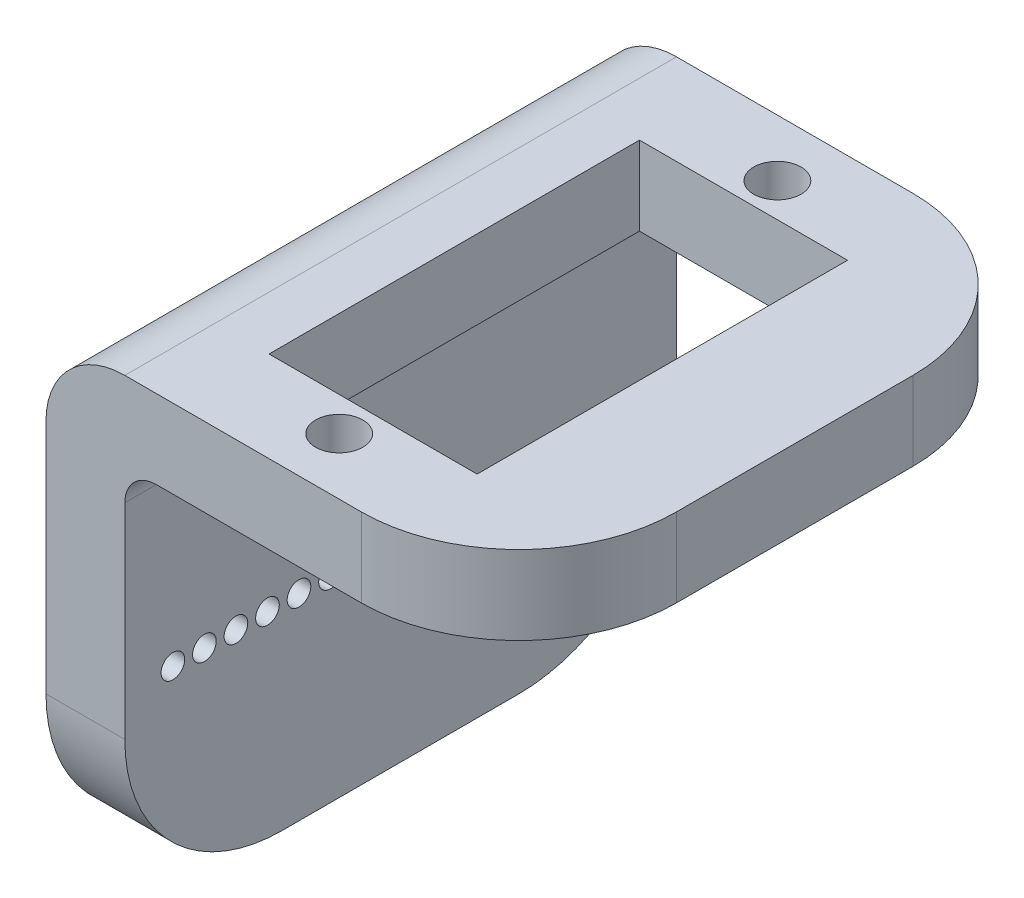
ISO-10303-21;
HEADER;
FILE_DESCRIPTION(('STEP AP214'),'2;1');
FILE_NAME('part.step','',(''),(''),'','','');
FILE_SCHEMA(('AUTOMOTIVE_DESIGN { 1 0 10303 214 1 1 1 1 }'));
ENDSEC;
DATA;
#1=APPLICATION_CONTEXT('core data for automotive mechanical design processes');
#2=APPLICATION_PROTOCOL_DEFINITION('international standard','automotive_design',2000,#1);
#3=PRODUCT_CONTEXT('',#1,'mechanical');
#4=PRODUCT('Part','Part','',(#3));
#5=PRODUCT_RELATED_PRODUCT_CATEGORY('part','',(#4));
#6=PRODUCT_DEFINITION_FORMATION('','',#4);
#7=PRODUCT_DEFINITION_CONTEXT('part definition',#1,'design');
#8=PRODUCT_DEFINITION('design','',#6,#7);
#9=PRODUCT_DEFINITION_SHAPE('','',#8);
#10=(LENGTH_UNIT() NAMED_UNIT(*) SI_UNIT(.MILLI.,.METRE.));
#11=(NAMED_UNIT(*) PLANE_ANGLE_UNIT() SI_UNIT($,.RADIAN.));
#12=(NAMED_UNIT(*) SI_UNIT($,.STERADIAN.) SOLID_ANGLE_UNIT());
#13=UNCERTAINTY_MEASURE_WITH_UNIT(LENGTH_MEASURE(1.E-05),#10,'distance_accuracy_value','');
#14=(GEOMETRIC_REPRESENTATION_CONTEXT(3) GLOBAL_UNCERTAINTY_ASSIGNED_CONTEXT((#13)) GLOBAL_UNIT_ASSIGNED_CONTEXT((#10,
#11,#12)) REPRESENTATION_CONTEXT('',''));
#15=CARTESIAN_POINT('',(0.,0.,0.));
#16=DIRECTION('',(0.,0.,1.));
#17=DIRECTION('',(1.,0.,0.));
#18=AXIS2_PLACEMENT_3D('',#15,#16,#17);
#19=CARTESIAN_POINT('',(5.,0.,17.5));
#20=DIRECTION('',(0.,0.,1.));
#21=DIRECTION('',(0.,-1.,0.));
#22=AXIS2_PLACEMENT_3D('',#19,#20,#21);
#23=PLANE('',#22);
#24=DIRECTION('',(0.,1.,0.));
#25=VECTOR('',#24,1.);
#26=CARTESIAN_POINT('',(0.,0.,17.5));
#27=LINE('',#26,#25);
#28=CARTESIAN_POINT('',(0.,-2.5,17.5));
#29=VERTEX_POINT('',#28);
#30=CARTESIAN_POINT('',(0.,12.5,17.5));
#31=VERTEX_POINT('',#30);
#32=EDGE_CURVE('E285',#29,#31,#27,.T.);
#33=ORIENTED_EDGE('',*,*,#32,.F.);
#34=DIRECTION('',(-1.,0.,0.));
#35=VECTOR('',#34,1.);
#36=CARTESIAN_POINT('',(5.,-2.5,17.5));
#37=LINE('',#36,#35);
#38=CARTESIAN_POINT('',(5.,-2.5,17.5));
#39=VERTEX_POINT('',#38);
#40=EDGE_CURVE('E11',#29,#39,#37,.F.);
#41=ORIENTED_EDGE('',*,*,#40,.T.);
#42=DIRECTION('',(0.,1.,0.));
#43=VECTOR('',#42,1.);
#44=CARTESIAN_POINT('',(5.,0.,17.5));
#45=LINE('',#44,#43);
#46=CARTESIAN_POINT('',(5.,10.5,17.5));
#47=VERTEX_POINT('',#46);
#48=EDGE_CURVE('E243',#39,#47,#45,.T.);
#49=ORIENTED_EDGE('',*,*,#48,.T.);
#50=CARTESIAN_POINT('',(7.,10.5,17.5));
#51=DIRECTION('',(0.,0.,1.));
#52=DIRECTION('',(0.,-1.,0.));
#53=AXIS2_PLACEMENT_3D('',#50,#51,#52);
#54=CIRCLE('',#53,2.);
#55=CARTESIAN_POINT('',(7.,12.5,17.5));
#56=VERTEX_POINT('',#55);
#57=EDGE_CURVE('E335',#47,#56,#54,.F.);
#58=ORIENTED_EDGE('',*,*,#57,.T.);
#59=DIRECTION('',(1.,0.,0.));
#60=VECTOR('',#59,1.);
#61=CARTESIAN_POINT('',(0.,12.5,17.5));
#62=LINE('',#61,#60);
#63=CARTESIAN_POINT('',(20.,12.5,17.5));
#64=VERTEX_POINT('',#63);
#65=EDGE_CURVE('E207',#56,#64,#62,.T.);
#66=ORIENTED_EDGE('',*,*,#65,.T.);
#67=DIRECTION('',(0.,-1.,0.));
#68=VECTOR('',#67,1.);
#69=CARTESIAN_POINT('',(20.,17.5,17.5));
#70=LINE('',#69,#68);
#71=CARTESIAN_POINT('',(20.,17.5,17.5));
#72=VERTEX_POINT('',#71);
#73=EDGE_CURVE('E316',#64,#72,#70,.F.);
#74=ORIENTED_EDGE('',*,*,#73,.T.);
#75=DIRECTION('',(1.,0.,0.));
#76=VECTOR('',#75,1.);
#77=CARTESIAN_POINT('',(0.,17.5,17.5));
#78=LINE('',#77,#76);
#79=CARTESIAN_POINT('',(5.,17.5,17.5));
#80=VERTEX_POINT('',#79);
#81=EDGE_CURVE('E197',#80,#72,#78,.T.);
#82=ORIENTED_EDGE('',*,*,#81,.F.);
#83=CARTESIAN_POINT('',(5.,12.5,17.5));
#84=DIRECTION('',(0.,0.,1.));
#85=DIRECTION('',(0.,-1.,0.));
#86=AXIS2_PLACEMENT_3D('',#83,#84,#85);
#87=CIRCLE('',#86,5.);
#88=EDGE_CURVE('E322',#80,#31,#87,.T.);
#89=ORIENTED_EDGE('',*,*,#88,.T.);
#90=EDGE_LOOP('',(#33,#41,#49,#58,#66,#74,#82,#89));
#91=FACE_BOUND('',#90,.T.);
#92=ADVANCED_FACE('F34',(#91),#23,.T.);
#93=CARTESIAN_POINT('',(5.,-12.5,0.));
#94=DIRECTION('',(0.,-1.,0.));
#95=DIRECTION('',(0.,0.,-1.));
#96=AXIS2_PLACEMENT_3D('',#93,#94,#95);
#97=PLANE('',#96);
#98=DIRECTION('',(0.,0.,1.));
#99=VECTOR('',#98,1.);
#100=CARTESIAN_POINT('',(0.,-12.5,0.));
#101=LINE('',#100,#99);
#102=CARTESIAN_POINT('',(0.,-12.5,-7.5));
#103=VERTEX_POINT('',#102);
#104=CARTESIAN_POINT('',(0.,-12.5,7.5));
#105=VERTEX_POINT('',#104);
#106=EDGE_CURVE('E287',#103,#105,#101,.T.);
#107=ORIENTED_EDGE('',*,*,#106,.F.);
#108=DIRECTION('',(-1.,0.,0.));
#109=VECTOR('',#108,1.);
#110=CARTESIAN_POINT('',(5.,-12.5,-7.5));
#111=LINE('',#110,#109);
#112=CARTESIAN_POINT('',(5.,-12.5,-7.5));
#113=VERTEX_POINT('',#112);
#114=EDGE_CURVE('E350',#103,#113,#111,.F.);
#115=ORIENTED_EDGE('',*,*,#114,.T.);
#116=DIRECTION('',(0.,0.,1.));
#117=VECTOR('',#116,1.);
#118=CARTESIAN_POINT('',(5.,-12.5,0.));
#119=LINE('',#118,#117);
#120=CARTESIAN_POINT('',(5.,-12.5,7.5));
#121=VERTEX_POINT('',#120);
#122=EDGE_CURVE('E245',#113,#121,#119,.T.);
#123=ORIENTED_EDGE('',*,*,#122,.T.);
#124=DIRECTION('',(-1.,0.,0.));
#125=VECTOR('',#124,1.);
#126=CARTESIAN_POINT('',(5.,-12.5,7.5));
#127=LINE('',#126,#125);
#128=EDGE_CURVE('E347',#121,#105,#127,.T.);
#129=ORIENTED_EDGE('',*,*,#128,.T.);
#130=EDGE_LOOP('',(#107,#115,#123,#129));
#131=FACE_BOUND('',#130,.T.);
#132=ADVANCED_FACE('F370',(#131),#97,.T.);
#133=CARTESIAN_POINT('',(5.,0.,-17.5));
#134=DIRECTION('',(0.,0.,1.));
#135=DIRECTION('',(0.,-1.,0.));
#136=AXIS2_PLACEMENT_3D('',#133,#134,#135);
#137=PLANE('',#136);
#138=DIRECTION('',(0.,1.,0.));
#139=VECTOR('',#138,1.);
#140=CARTESIAN_POINT('',(5.,0.,-17.5));
#141=LINE('',#140,#139);
#142=CARTESIAN_POINT('',(5.,-2.49999999999998,-17.5));
#143=VERTEX_POINT('',#142);
#144=CARTESIAN_POINT('',(5.,10.5,-17.5));
#145=VERTEX_POINT('',#144);
#146=EDGE_CURVE('E247',#143,#145,#141,.T.);
#147=ORIENTED_EDGE('',*,*,#146,.F.);
#148=DIRECTION('',(-1.,0.,0.));
#149=VECTOR('',#148,1.);
#150=CARTESIAN_POINT('',(0.,-2.49999999999998,-17.5));
#151=LINE('',#150,#149);
#152=CARTESIAN_POINT('',(0.,-2.49999999999998,-17.5));
#153=VERTEX_POINT('',#152);
#154=EDGE_CURVE('E340',#143,#153,#151,.T.);
#155=ORIENTED_EDGE('',*,*,#154,.T.);
#156=DIRECTION('',(0.,1.,0.));
#157=VECTOR('',#156,1.);
#158=CARTESIAN_POINT('',(0.,0.,-17.5));
#159=LINE('',#158,#157);
#160=CARTESIAN_POINT('',(0.,12.5,-17.5));
#161=VERTEX_POINT('',#160);
#162=EDGE_CURVE('E290',#153,#161,#159,.T.);
#163=ORIENTED_EDGE('',*,*,#162,.T.);
#164=CARTESIAN_POINT('',(5.,12.5,-17.5));
#165=DIRECTION('',(0.,0.,1.));
#166=DIRECTION('',(0.,-1.,0.));
#167=AXIS2_PLACEMENT_3D('',#164,#165,#166);
#168=CIRCLE('',#167,5.);
#169=CARTESIAN_POINT('',(5.,17.5,-17.5));
#170=VERTEX_POINT('',#169);
#171=EDGE_CURVE('E328',#161,#170,#168,.F.);
#172=ORIENTED_EDGE('',*,*,#171,.T.);
#173=DIRECTION('',(-1.,0.,0.));
#174=VECTOR('',#173,1.);
#175=CARTESIAN_POINT('',(0.,17.5,-17.5));
#176=LINE('',#175,#174);
#177=CARTESIAN_POINT('',(20.,17.5,-17.5));
#178=VERTEX_POINT('',#177);
#179=EDGE_CURVE('E203',#178,#170,#176,.T.);
#180=ORIENTED_EDGE('',*,*,#179,.F.);
#181=DIRECTION('',(0.,-1.,0.));
#182=VECTOR('',#181,1.);
#183=CARTESIAN_POINT('',(20.,0.,-17.5));
#184=LINE('',#183,#182);
#185=CARTESIAN_POINT('',(20.,12.5,-17.5));
#186=VERTEX_POINT('',#185);
#187=EDGE_CURVE('E258',#178,#186,#184,.T.);
#188=ORIENTED_EDGE('',*,*,#187,.T.);
#189=DIRECTION('',(-1.,0.,0.));
#190=VECTOR('',#189,1.);
#191=CARTESIAN_POINT('',(0.,12.5,-17.5));
#192=LINE('',#191,#190);
#193=CARTESIAN_POINT('',(7.,12.5,-17.5));
#194=VERTEX_POINT('',#193);
#195=EDGE_CURVE('E200',#186,#194,#192,.T.);
#196=ORIENTED_EDGE('',*,*,#195,.T.);
#197=CARTESIAN_POINT('',(7.,10.5,-17.5));
#198=DIRECTION('',(0.,0.,1.));
#199=DIRECTION('',(0.,-1.,0.));
#200=AXIS2_PLACEMENT_3D('',#197,#198,#199);
#201=CIRCLE('',#200,2.);
#202=EDGE_CURVE('E337',#194,#145,#201,.T.);
#203=ORIENTED_EDGE('',*,*,#202,.T.);
#204=EDGE_LOOP('',(#147,#155,#163,#172,#180,#188,#196,#203));
#205=FACE_BOUND('',#204,.T.);
#206=ADVANCED_FACE('F360',(#205),#137,.F.);
#207=CARTESIAN_POINT('',(5.,0.,-10.45));
#208=DIRECTION('',(-1.,0.,0.));
#209=DIRECTION('',(0.,0.,1.));
#210=AXIS2_PLACEMENT_3D('',#207,#208,#209);
#211=CYLINDRICAL_SURFACE('',#210,0.75);
#212=CARTESIAN_POINT('',(5.,0.,-10.45));
#213=DIRECTION('',(1.,0.,0.));
#214=DIRECTION('',(0.,0.,-1.));
#215=AXIS2_PLACEMENT_3D('',#212,#213,#214);
#216=CIRCLE('',#215,0.75);
#217=CARTESIAN_POINT('',(5.,0.,-11.2));
#218=VERTEX_POINT('',#217);
#219=EDGE_CURVE('E252',#218,#218,#216,.F.);
#220=ORIENTED_EDGE('',*,*,#219,.F.);
#221=EDGE_LOOP('',(#220));
#222=FACE_BOUND('',#221,.T.);
#223=CARTESIAN_POINT('',(0.,0.,-10.45));
#224=DIRECTION('',(1.,0.,0.));
#225=DIRECTION('',(0.,0.,-1.));
#226=AXIS2_PLACEMENT_3D('',#223,#224,#225);
#227=CIRCLE('',#226,0.75);
#228=CARTESIAN_POINT('',(0.,0.,-11.2));
#229=VERTEX_POINT('',#228);
#230=EDGE_CURVE('E295',#229,#229,#227,.F.);
#231=ORIENTED_EDGE('',*,*,#230,.T.);
#232=EDGE_LOOP('',(#231));
#233=FACE_BOUND('',#232,.T.);
#234=ADVANCED_FACE('F508',(#222,#233),#211,.F.);
#235=CARTESIAN_POINT('',(5.,0.,-6.45));
#236=DIRECTION('',(-1.,0.,0.));
#237=DIRECTION('',(0.,0.,1.));
#238=AXIS2_PLACEMENT_3D('',#235,#236,#237);
#239=CYLINDRICAL_SURFACE('',#238,0.75);
#240=CARTESIAN_POINT('',(5.,0.,-6.45));
#241=DIRECTION('',(1.,0.,0.));
#242=DIRECTION('',(0.,0.,-1.));
#243=AXIS2_PLACEMENT_3D('',#240,#241,#242);
#244=CIRCLE('',#243,0.75);
#245=CARTESIAN_POINT('',(5.,0.,-7.2));
#246=VERTEX_POINT('',#245);
#247=EDGE_CURVE('E249',#246,#246,#244,.F.);
#248=ORIENTED_EDGE('',*,*,#247,.F.);
#249=EDGE_LOOP('',(#248));
#250=FACE_BOUND('',#249,.T.);
#251=CARTESIAN_POINT('',(0.,0.,-6.45));
#252=DIRECTION('',(1.,0.,0.));
#253=DIRECTION('',(0.,0.,-1.));
#254=AXIS2_PLACEMENT_3D('',#251,#252,#253);
#255=CIRCLE('',#254,0.75);
#256=CARTESIAN_POINT('',(0.,0.,-7.2));
#257=VERTEX_POINT('',#256);
#258=EDGE_CURVE('E292',#257,#257,#255,.F.);
#259=ORIENTED_EDGE('',*,*,#258,.T.);
#260=EDGE_LOOP('',(#259));
#261=FACE_BOUND('',#260,.T.);
#262=ADVANCED_FACE('F427',(#250,#261),#239,.F.);
#263=CARTESIAN_POINT('',(5.,0.,14.45));
#264=DIRECTION('',(-1.,0.,0.));
#265=DIRECTION('',(0.,0.,1.));
#266=AXIS2_PLACEMENT_3D('',#263,#264,#265);
#267=CYLINDRICAL_SURFACE('',#266,0.750000000000002);
#268=CARTESIAN_POINT('',(5.,0.,14.45));
#269=DIRECTION('',(1.,0.,0.));
#270=DIRECTION('',(0.,0.,-1.));
#271=AXIS2_PLACEMENT_3D('',#268,#269,#270);
#272=CIRCLE('',#271,0.750000000000002);
#273=CARTESIAN_POINT('',(5.,0.,13.7));
#274=VERTEX_POINT('',#273);
#275=EDGE_CURVE('E240',#274,#274,#272,.T.);
#276=ORIENTED_EDGE('',*,*,#275,.T.);
#277=EDGE_LOOP('',(#276));
#278=FACE_BOUND('',#277,.T.);
#279=CARTESIAN_POINT('',(0.,0.,14.45));
#280=DIRECTION('',(1.,0.,0.));
#281=DIRECTION('',(0.,0.,-1.));
#282=AXIS2_PLACEMENT_3D('',#279,#280,#281);
#283=CIRCLE('',#282,0.750000000000002);
#284=CARTESIAN_POINT('',(0.,0.,13.7));
#285=VERTEX_POINT('',#284);
#286=EDGE_CURVE('E282',#285,#285,#283,.T.);
#287=ORIENTED_EDGE('',*,*,#286,.F.);
#288=EDGE_LOOP('',(#287));
#289=FACE_BOUND('',#288,.T.);
#290=ADVANCED_FACE('F423',(#278,#289),#267,.F.);
#291=CARTESIAN_POINT('',(5.,0.,12.45));
#292=DIRECTION('',(-1.,0.,0.));
#293=DIRECTION('',(0.,0.,1.));
#294=AXIS2_PLACEMENT_3D('',#291,#292,#293);
#295=CYLINDRICAL_SURFACE('',#294,0.75);
#296=CARTESIAN_POINT('',(5.,0.,12.45));
#297=DIRECTION('',(1.,0.,0.));
#298=DIRECTION('',(0.,0.,-1.));
#299=AXIS2_PLACEMENT_3D('',#296,#297,#298);
#300=CIRCLE('',#299,0.75);
#301=CARTESIAN_POINT('',(5.,0.,11.7));
#302=VERTEX_POINT('',#301);
#303=EDGE_CURVE('E237',#302,#302,#300,.T.);
#304=ORIENTED_EDGE('',*,*,#303,.T.);
#305=EDGE_LOOP('',(#304));
#306=FACE_BOUND('',#305,.T.);
#307=CARTESIAN_POINT('',(0.,0.,12.45));
#308=DIRECTION('',(1.,0.,0.));
#309=DIRECTION('',(0.,0.,-1.));
#310=AXIS2_PLACEMENT_3D('',#307,#308,#309);
#311=CIRCLE('',#310,0.75);
#312=CARTESIAN_POINT('',(0.,0.,11.7));
#313=VERTEX_POINT('',#312);
#314=EDGE_CURVE('E279',#313,#313,#311,.T.);
#315=ORIENTED_EDGE('',*,*,#314,.F.);
#316=EDGE_LOOP('',(#315));
#317=FACE_BOUND('',#316,.T.);
#318=ADVANCED_FACE('F426',(#306,#317),#295,.F.);
#319=CARTESIAN_POINT('',(5.,0.,10.45));
#320=DIRECTION('',(-1.,0.,0.));
#321=DIRECTION('',(0.,0.,1.));
#322=AXIS2_PLACEMENT_3D('',#319,#320,#321);
#323=CYLINDRICAL_SURFACE('',#322,0.75);
#324=CARTESIAN_POINT('',(5.,0.,10.45));
#325=DIRECTION('',(1.,0.,0.));
#326=DIRECTION('',(0.,0.,-1.));
#327=AXIS2_PLACEMENT_3D('',#324,#325,#326);
#328=CIRCLE('',#327,0.75);
#329=CARTESIAN_POINT('',(5.,0.,9.69999999999999));
#330=VERTEX_POINT('',#329);
#331=EDGE_CURVE('E234',#330,#330,#328,.T.);
#332=ORIENTED_EDGE('',*,*,#331,.T.);
#333=EDGE_LOOP('',(#332));
#334=FACE_BOUND('',#333,.T.);
#335=CARTESIAN_POINT('',(0.,0.,10.45));
#336=DIRECTION('',(1.,0.,0.));
#337=DIRECTION('',(0.,0.,-1.));
#338=AXIS2_PLACEMENT_3D('',#335,#336,#337);
#339=CIRCLE('',#338,0.75);
#340=CARTESIAN_POINT('',(0.,0.,9.69999999999999));
#341=VERTEX_POINT('',#340);
#342=EDGE_CURVE('E276',#341,#341,#339,.T.);
#343=ORIENTED_EDGE('',*,*,#342,.F.);
#344=EDGE_LOOP('',(#343));
#345=FACE_BOUND('',#344,.T.);
#346=ADVANCED_FACE('F431',(#334,#345),#323,.F.);
#347=CARTESIAN_POINT('',(5.,0.,8.44999999999999));
#348=DIRECTION('',(-1.,0.,0.));
#349=DIRECTION('',(0.,0.,1.));
#350=AXIS2_PLACEMENT_3D('',#347,#348,#349);
#351=CYLINDRICAL_SURFACE('',#350,0.75);
#352=CARTESIAN_POINT('',(5.,0.,8.44999999999999));
#353=DIRECTION('',(1.,0.,0.));
#354=DIRECTION('',(0.,0.,-1.));
#355=AXIS2_PLACEMENT_3D('',#352,#353,#354);
#356=CIRCLE('',#355,0.75);
#357=CARTESIAN_POINT('',(5.,0.,7.69999999999999));
#358=VERTEX_POINT('',#357);
#359=EDGE_CURVE('E231',#358,#358,#356,.T.);
#360=ORIENTED_EDGE('',*,*,#359,.T.);
#361=EDGE_LOOP('',(#360));
#362=FACE_BOUND('',#361,.T.);
#363=CARTESIAN_POINT('',(0.,0.,8.44999999999999));
#364=DIRECTION('',(1.,0.,0.));
#365=DIRECTION('',(0.,0.,-1.));
#366=AXIS2_PLACEMENT_3D('',#363,#364,#365);
#367=CIRCLE('',#366,0.75);
#368=CARTESIAN_POINT('',(0.,0.,7.69999999999999));
#369=VERTEX_POINT('',#368);
#370=EDGE_CURVE('E273',#369,#369,#367,.T.);
#371=ORIENTED_EDGE('',*,*,#370,.F.);
#372=EDGE_LOOP('',(#371));
#373=FACE_BOUND('',#372,.T.);
#374=ADVANCED_FACE('F435',(#362,#373),#351,.F.);
#375=CARTESIAN_POINT('',(5.,0.,6.44999999999999));
#376=DIRECTION('',(-1.,0.,0.));
#377=DIRECTION('',(0.,0.,1.));
#378=AXIS2_PLACEMENT_3D('',#375,#376,#377);
#379=CYLINDRICAL_SURFACE('',#378,0.75);
#380=CARTESIAN_POINT('',(5.,0.,6.44999999999999));
#381=DIRECTION('',(1.,0.,0.));
#382=DIRECTION('',(0.,0.,-1.));
#383=AXIS2_PLACEMENT_3D('',#380,#381,#382);
#384=CIRCLE('',#383,0.75);
#385=CARTESIAN_POINT('',(5.,0.,5.69999999999999));
#386=VERTEX_POINT('',#385);
#387=EDGE_CURVE('E228',#386,#386,#384,.T.);
#388=ORIENTED_EDGE('',*,*,#387,.T.);
#389=EDGE_LOOP('',(#388));
#390=FACE_BOUND('',#389,.T.);
#391=CARTESIAN_POINT('',(0.,0.,6.44999999999999));
#392=DIRECTION('',(1.,0.,0.));
#393=DIRECTION('',(0.,0.,-1.));
#394=AXIS2_PLACEMENT_3D('',#391,#392,#393);
#395=CIRCLE('',#394,0.75);
#396=CARTESIAN_POINT('',(0.,0.,5.69999999999999));
#397=VERTEX_POINT('',#396);
#398=EDGE_CURVE('E270',#397,#397,#395,.T.);
#399=ORIENTED_EDGE('',*,*,#398,.F.);
#400=EDGE_LOOP('',(#399));
#401=FACE_BOUND('',#400,.T.);
#402=ADVANCED_FACE('F439',(#390,#401),#379,.F.);
#403=CARTESIAN_POINT('',(5.,0.,4.44999999999999));
#404=DIRECTION('',(-1.,0.,0.));
#405=DIRECTION('',(0.,0.,1.));
#406=AXIS2_PLACEMENT_3D('',#403,#404,#405);
#407=CYLINDRICAL_SURFACE('',#406,0.750000000000002);
#408=CARTESIAN_POINT('',(5.,0.,4.44999999999999));
#409=DIRECTION('',(1.,0.,0.));
#410=DIRECTION('',(0.,0.,-1.));
#411=AXIS2_PLACEMENT_3D('',#408,#409,#410);
#412=CIRCLE('',#411,0.750000000000002);
#413=CARTESIAN_POINT('',(5.,0.,3.69999999999999));
#414=VERTEX_POINT('',#413);
#415=EDGE_CURVE('E225',#414,#414,#412,.T.);
#416=ORIENTED_EDGE('',*,*,#415,.T.);
#417=EDGE_LOOP('',(#416));
#418=FACE_BOUND('',#417,.T.);
#419=CARTESIAN_POINT('',(0.,0.,4.44999999999999));
#420=DIRECTION('',(1.,0.,0.));
#421=DIRECTION('',(0.,0.,-1.));
#422=AXIS2_PLACEMENT_3D('',#419,#420,#421);
#423=CIRCLE('',#422,0.750000000000002);
#424=CARTESIAN_POINT('',(0.,0.,3.69999999999999));
#425=VERTEX_POINT('',#424);
#426=EDGE_CURVE('E267',#425,#425,#423,.T.);
#427=ORIENTED_EDGE('',*,*,#426,.F.);
#428=EDGE_LOOP('',(#427));
#429=FACE_BOUND('',#428,.T.);
#430=ADVANCED_FACE('F443',(#418,#429),#407,.F.);
#431=CARTESIAN_POINT('',(5.,0.,-4.45));
#432=DIRECTION('',(-1.,0.,0.));
#433=DIRECTION('',(0.,0.,1.));
#434=AXIS2_PLACEMENT_3D('',#431,#432,#433);
#435=CYLINDRICAL_SURFACE('',#434,0.750000000000002);
#436=CARTESIAN_POINT('',(5.,0.,-4.45));
#437=DIRECTION('',(1.,0.,0.));
#438=DIRECTION('',(0.,0.,-1.));
#439=AXIS2_PLACEMENT_3D('',#436,#437,#438);
#440=CIRCLE('',#439,0.750000000000002);
#441=CARTESIAN_POINT('',(5.,0.,-5.2));
#442=VERTEX_POINT('',#441);
#443=EDGE_CURVE('E222',#442,#442,#440,.F.);
#444=ORIENTED_EDGE('',*,*,#443,.F.);
#445=EDGE_LOOP('',(#444));
#446=FACE_BOUND('',#445,.T.);
#447=CARTESIAN_POINT('',(0.,0.,-4.45));
#448=DIRECTION('',(1.,0.,0.));
#449=DIRECTION('',(0.,0.,-1.));
#450=AXIS2_PLACEMENT_3D('',#447,#448,#449);
#451=CIRCLE('',#450,0.750000000000002);
#452=CARTESIAN_POINT('',(0.,0.,-5.2));
#453=VERTEX_POINT('',#452);
#454=EDGE_CURVE('E264',#453,#453,#451,.F.);
#455=ORIENTED_EDGE('',*,*,#454,.T.);
#456=EDGE_LOOP('',(#455));
#457=FACE_BOUND('',#456,.T.);
#458=ADVANCED_FACE('F447',(#446,#457),#435,.F.);
#459=CARTESIAN_POINT('',(5.,0.,-8.45));
#460=DIRECTION('',(-1.,0.,0.));
#461=DIRECTION('',(0.,0.,1.));
#462=AXIS2_PLACEMENT_3D('',#459,#460,#461);
#463=CYLINDRICAL_SURFACE('',#462,0.75);
#464=CARTESIAN_POINT('',(5.,0.,-8.45));
#465=DIRECTION('',(1.,0.,0.));
#466=DIRECTION('',(0.,0.,-1.));
#467=AXIS2_PLACEMENT_3D('',#464,#465,#466);
#468=CIRCLE('',#467,0.75);
#469=CARTESIAN_POINT('',(5.,0.,-9.2));
#470=VERTEX_POINT('',#469);
#471=EDGE_CURVE('E218',#470,#470,#468,.F.);
#472=ORIENTED_EDGE('',*,*,#471,.F.);
#473=EDGE_LOOP('',(#472));
#474=FACE_BOUND('',#473,.T.);
#475=CARTESIAN_POINT('',(0.,0.,-8.45));
#476=DIRECTION('',(1.,0.,0.));
#477=DIRECTION('',(0.,0.,-1.));
#478=AXIS2_PLACEMENT_3D('',#475,#476,#477);
#479=CIRCLE('',#478,0.75);
#480=CARTESIAN_POINT('',(0.,0.,-9.2));
#481=VERTEX_POINT('',#480);
#482=EDGE_CURVE('E261',#481,#481,#479,.F.);
#483=ORIENTED_EDGE('',*,*,#482,.T.);
#484=EDGE_LOOP('',(#483));
#485=FACE_BOUND('',#484,.T.);
#486=ADVANCED_FACE('F451',(#474,#485),#463,.F.);
#487=CARTESIAN_POINT('',(5.,0.,-12.45));
#488=DIRECTION('',(-1.,0.,0.));
#489=DIRECTION('',(0.,0.,1.));
#490=AXIS2_PLACEMENT_3D('',#487,#488,#489);
#491=CYLINDRICAL_SURFACE('',#490,0.75);
#492=CARTESIAN_POINT('',(5.,0.,-12.45));
#493=DIRECTION('',(1.,0.,0.));
#494=DIRECTION('',(0.,0.,-1.));
#495=AXIS2_PLACEMENT_3D('',#492,#493,#494);
#496=CIRCLE('',#495,0.75);
#497=CARTESIAN_POINT('',(5.,0.,-13.2));
#498=VERTEX_POINT('',#497);
#499=EDGE_CURVE('E215',#498,#498,#496,.F.);
#500=ORIENTED_EDGE('',*,*,#499,.F.);
#501=EDGE_LOOP('',(#500));
#502=FACE_BOUND('',#501,.T.);
#503=CARTESIAN_POINT('',(0.,0.,-12.45));
#504=DIRECTION('',(1.,0.,0.));
#505=DIRECTION('',(0.,0.,-1.));
#506=AXIS2_PLACEMENT_3D('',#503,#504,#505);
#507=CIRCLE('',#506,0.75);
#508=CARTESIAN_POINT('',(0.,0.,-13.2));
#509=VERTEX_POINT('',#508);
#510=EDGE_CURVE('E206',#509,#509,#507,.F.);
#511=ORIENTED_EDGE('',*,*,#510,.T.);
#512=EDGE_LOOP('',(#511));
#513=FACE_BOUND('',#512,.T.);
#514=ADVANCED_FACE('F455',(#502,#513),#491,.F.);
#515=CARTESIAN_POINT('',(5.,0.,-14.45));
#516=DIRECTION('',(-1.,0.,0.));
#517=DIRECTION('',(0.,0.,1.));
#518=AXIS2_PLACEMENT_3D('',#515,#516,#517);
#519=CYLINDRICAL_SURFACE('',#518,0.750000000000002);
#520=CARTESIAN_POINT('',(5.,0.,-14.45));
#521=DIRECTION('',(1.,0.,0.));
#522=DIRECTION('',(0.,0.,-1.));
#523=AXIS2_PLACEMENT_3D('',#520,#521,#522);
#524=CIRCLE('',#523,0.750000000000002);
#525=CARTESIAN_POINT('',(5.,0.,-15.2));
#526=VERTEX_POINT('',#525);
#527=EDGE_CURVE('E255',#526,#526,#524,.F.);
#528=ORIENTED_EDGE('',*,*,#527,.F.);
#529=EDGE_LOOP('',(#528));
#530=FACE_BOUND('',#529,.T.);
#531=CARTESIAN_POINT('',(0.,0.,-14.45));
#532=DIRECTION('',(1.,0.,0.));
#533=DIRECTION('',(0.,0.,-1.));
#534=AXIS2_PLACEMENT_3D('',#531,#532,#533);
#535=CIRCLE('',#534,0.750000000000002);
#536=CARTESIAN_POINT('',(0.,0.,-15.2));
#537=VERTEX_POINT('',#536);
#538=EDGE_CURVE('E219',#537,#537,#535,.F.);
#539=ORIENTED_EDGE('',*,*,#538,.T.);
#540=EDGE_LOOP('',(#539));
#541=FACE_BOUND('',#540,.T.);
#542=ADVANCED_FACE('F459',(#530,#541),#519,.F.);
#543=CARTESIAN_POINT('',(5.,0.,0.));
#544=DIRECTION('',(1.,0.,0.));
#545=DIRECTION('',(0.,0.,-1.));
#546=AXIS2_PLACEMENT_3D('',#543,#544,#545);
#547=PLANE('',#546);
#548=ORIENTED_EDGE('',*,*,#499,.T.);
#549=EDGE_LOOP('',(#548));
#550=FACE_BOUND('',#549,.T.);
#551=ORIENTED_EDGE('',*,*,#471,.T.);
#552=EDGE_LOOP('',(#551));
#553=FACE_BOUND('',#552,.T.);
#554=ORIENTED_EDGE('',*,*,#443,.T.);
#555=EDGE_LOOP('',(#554));
#556=FACE_BOUND('',#555,.T.);
#557=ORIENTED_EDGE('',*,*,#415,.F.);
#558=EDGE_LOOP('',(#557));
#559=FACE_BOUND('',#558,.T.);
#560=ORIENTED_EDGE('',*,*,#387,.F.);
#561=EDGE_LOOP('',(#560));
#562=FACE_BOUND('',#561,.T.);
#563=ORIENTED_EDGE('',*,*,#359,.F.);
#564=EDGE_LOOP('',(#563));
#565=FACE_BOUND('',#564,.T.);
#566=ORIENTED_EDGE('',*,*,#331,.F.);
#567=EDGE_LOOP('',(#566));
#568=FACE_BOUND('',#567,.T.);
#569=ORIENTED_EDGE('',*,*,#303,.F.);
#570=EDGE_LOOP('',(#569));
#571=FACE_BOUND('',#570,.T.);
#572=ORIENTED_EDGE('',*,*,#275,.F.);
#573=EDGE_LOOP('',(#572));
#574=FACE_BOUND('',#573,.T.);
#575=ORIENTED_EDGE('',*,*,#122,.F.);
#576=CARTESIAN_POINT('',(5.,-2.49999999999999,-7.5));
#577=DIRECTION('',(1.,0.,0.));
#578=DIRECTION('',(0.,0.,-1.));
#579=AXIS2_PLACEMENT_3D('',#576,#577,#578);
#580=CIRCLE('',#579,10.);
#581=EDGE_CURVE('E42',#113,#143,#580,.T.);
#582=ORIENTED_EDGE('',*,*,#581,.T.);
#583=ORIENTED_EDGE('',*,*,#146,.T.);
#584=DIRECTION('',(0.,0.,1.));
#585=VECTOR('',#584,1.);
#586=CARTESIAN_POINT('',(5.,10.5,0.));
#587=LINE('',#586,#585);
#588=EDGE_CURVE('E330',#145,#47,#587,.T.);
#589=ORIENTED_EDGE('',*,*,#588,.T.);
#590=ORIENTED_EDGE('',*,*,#48,.F.);
#591=CARTESIAN_POINT('',(5.,-2.49999999999999,7.5));
#592=DIRECTION('',(1.,0.,0.));
#593=DIRECTION('',(0.,0.,-1.));
#594=AXIS2_PLACEMENT_3D('',#591,#592,#593);
#595=CIRCLE('',#594,10.);
#596=EDGE_CURVE('E54',#39,#121,#595,.T.);
#597=ORIENTED_EDGE('',*,*,#596,.T.);
#598=EDGE_LOOP('',(#575,#582,#583,#589,#590,#597));
#599=FACE_BOUND('',#598,.T.);
#600=ORIENTED_EDGE('',*,*,#247,.T.);
#601=EDGE_LOOP('',(#600));
#602=FACE_BOUND('',#601,.T.);
#603=ORIENTED_EDGE('',*,*,#219,.T.);
#604=EDGE_LOOP('',(#603));
#605=FACE_BOUND('',#604,.T.);
#606=ORIENTED_EDGE('',*,*,#527,.T.);
#607=EDGE_LOOP('',(#606));
#608=FACE_BOUND('',#607,.T.);
#609=ADVANCED_FACE('F354',(#550,#553,#556,#559,#562,#565,#568,#571,#574,#599,#602,#605,#608),
#547,.T.);
#610=CARTESIAN_POINT('',(0.,0.,0.));
#611=DIRECTION('',(1.,0.,0.));
#612=DIRECTION('',(0.,0.,-1.));
#613=AXIS2_PLACEMENT_3D('',#610,#611,#612);
#614=PLANE('',#613);
#615=ORIENTED_EDGE('',*,*,#510,.F.);
#616=EDGE_LOOP('',(#615));
#617=FACE_BOUND('',#616,.T.);
#618=ORIENTED_EDGE('',*,*,#482,.F.);
#619=EDGE_LOOP('',(#618));
#620=FACE_BOUND('',#619,.T.);
#621=ORIENTED_EDGE('',*,*,#454,.F.);
#622=EDGE_LOOP('',(#621));
#623=FACE_BOUND('',#622,.T.);
#624=ORIENTED_EDGE('',*,*,#426,.T.);
#625=EDGE_LOOP('',(#624));
#626=FACE_BOUND('',#625,.T.);
#627=ORIENTED_EDGE('',*,*,#398,.T.);
#628=EDGE_LOOP('',(#627));
#629=FACE_BOUND('',#628,.T.);
#630=ORIENTED_EDGE('',*,*,#370,.T.);
#631=EDGE_LOOP('',(#630));
#632=FACE_BOUND('',#631,.T.);
#633=ORIENTED_EDGE('',*,*,#342,.T.);
#634=EDGE_LOOP('',(#633));
#635=FACE_BOUND('',#634,.T.);
#636=ORIENTED_EDGE('',*,*,#314,.T.);
#637=EDGE_LOOP('',(#636));
#638=FACE_BOUND('',#637,.T.);
#639=ORIENTED_EDGE('',*,*,#286,.T.);
#640=EDGE_LOOP('',(#639));
#641=FACE_BOUND('',#640,.T.);
#642=ORIENTED_EDGE('',*,*,#162,.F.);
#643=CARTESIAN_POINT('',(0.,-2.49999999999999,-7.5));
#644=DIRECTION('',(1.,0.,0.));
#645=DIRECTION('',(0.,0.,-1.));
#646=AXIS2_PLACEMENT_3D('',#643,#644,#645);
#647=CIRCLE('',#646,10.);
#648=EDGE_CURVE('E345',#153,#103,#647,.F.);
#649=ORIENTED_EDGE('',*,*,#648,.T.);
#650=ORIENTED_EDGE('',*,*,#106,.T.);
#651=CARTESIAN_POINT('',(0.,-2.49999999999999,7.5));
#652=DIRECTION('',(1.,0.,0.));
#653=DIRECTION('',(0.,0.,-1.));
#654=AXIS2_PLACEMENT_3D('',#651,#652,#653);
#655=CIRCLE('',#654,10.);
#656=EDGE_CURVE('E343',#105,#29,#655,.F.);
#657=ORIENTED_EDGE('',*,*,#656,.T.);
#658=ORIENTED_EDGE('',*,*,#32,.T.);
#659=DIRECTION('',(0.,0.,1.));
#660=VECTOR('',#659,1.);
#661=CARTESIAN_POINT('',(0.,12.5,-17.5));
#662=LINE('',#661,#660);
#663=EDGE_CURVE('E325',#31,#161,#662,.F.);
#664=ORIENTED_EDGE('',*,*,#663,.T.);
#665=EDGE_LOOP('',(#642,#649,#650,#657,#658,#664));
#666=FACE_BOUND('',#665,.T.);
#667=ORIENTED_EDGE('',*,*,#258,.F.);
#668=EDGE_LOOP('',(#667));
#669=FACE_BOUND('',#668,.T.);
#670=ORIENTED_EDGE('',*,*,#230,.F.);
#671=EDGE_LOOP('',(#670));
#672=FACE_BOUND('',#671,.T.);
#673=ORIENTED_EDGE('',*,*,#538,.F.);
#674=EDGE_LOOP('',(#673));
#675=FACE_BOUND('',#674,.T.);
#676=ADVANCED_FACE('F367',(#617,#620,#623,#626,#629,#632,#635,#638,#641,#666,#669,#672,#675),
#614,.F.);
#677=CARTESIAN_POINT('',(30.,17.5,-17.5));
#678=DIRECTION('',(-1.,0.,0.));
#679=DIRECTION('',(0.,0.,1.));
#680=AXIS2_PLACEMENT_3D('',#677,#678,#679);
#681=PLANE('',#680);
#682=DIRECTION('',(0.,0.,-1.));
#683=VECTOR('',#682,1.);
#684=CARTESIAN_POINT('',(30.,12.5,-17.5));
#685=LINE('',#684,#683);
#686=CARTESIAN_POINT('',(30.,12.5,7.50000000000001));
#687=VERTEX_POINT('',#686);
#688=CARTESIAN_POINT('',(30.,12.5,-7.5));
#689=VERTEX_POINT('',#688);
#690=EDGE_CURVE('E209',#687,#689,#685,.T.);
#691=ORIENTED_EDGE('',*,*,#690,.T.);
#692=DIRECTION('',(0.,-1.,0.));
#693=VECTOR('',#692,1.);
#694=CARTESIAN_POINT('',(30.,17.5,-7.49999999999999));
#695=LINE('',#694,#693);
#696=CARTESIAN_POINT('',(30.,17.5,-7.49999999999999));
#697=VERTEX_POINT('',#696);
#698=EDGE_CURVE('E310',#689,#697,#695,.F.);
#699=ORIENTED_EDGE('',*,*,#698,.T.);
#700=DIRECTION('',(0.,0.,-1.));
#701=VECTOR('',#700,1.);
#702=CARTESIAN_POINT('',(30.,17.5,-17.5));
#703=LINE('',#702,#701);
#704=CARTESIAN_POINT('',(30.,17.5,7.50000000000001));
#705=VERTEX_POINT('',#704);
#706=EDGE_CURVE('E199',#705,#697,#703,.T.);
#707=ORIENTED_EDGE('',*,*,#706,.F.);
#708=DIRECTION('',(0.,-1.,0.));
#709=VECTOR('',#708,1.);
#710=CARTESIAN_POINT('',(30.,12.5,7.50000000000001));
#711=LINE('',#710,#709);
#712=EDGE_CURVE('E307',#705,#687,#711,.T.);
#713=ORIENTED_EDGE('',*,*,#712,.T.);
#714=EDGE_LOOP('',(#691,#699,#707,#713));
#715=FACE_BOUND('',#714,.T.);
#716=ADVANCED_FACE('F402',(#715),#681,.F.);
#717=CARTESIAN_POINT('',(0.,17.5,0.));
#718=DIRECTION('',(0.,1.,0.));
#719=DIRECTION('',(0.,0.,1.));
#720=AXIS2_PLACEMENT_3D('',#717,#718,#719);
#721=PLANE('',#720);
#722=CARTESIAN_POINT('',(15.,17.5,-13.9));
#723=DIRECTION('',(0.,1.,0.));
#724=DIRECTION('',(0.,0.,1.));
#725=AXIS2_PLACEMENT_3D('',#722,#723,#724);
#726=CIRCLE('',#725,1.5);
#727=CARTESIAN_POINT('',(15.,17.5,-12.4));
#728=VERTEX_POINT('',#727);
#729=EDGE_CURVE('E167',#728,#728,#726,.T.);
#730=ORIENTED_EDGE('',*,*,#729,.F.);
#731=EDGE_LOOP('',(#730));
#732=FACE_BOUND('',#731,.T.);
#733=DIRECTION('',(1.,0.,0.));
#734=VECTOR('',#733,1.);
#735=CARTESIAN_POINT('',(21.6,17.5,11.75));
#736=LINE('',#735,#734);
#737=CARTESIAN_POINT('',(8.4,17.5,11.75));
#738=VERTEX_POINT('',#737);
#739=CARTESIAN_POINT('',(21.6,17.5,11.75));
#740=VERTEX_POINT('',#739);
#741=EDGE_CURVE('E154',#738,#740,#736,.T.);
#742=ORIENTED_EDGE('',*,*,#741,.F.);
#743=DIRECTION('',(0.,0.,1.));
#744=VECTOR('',#743,1.);
#745=CARTESIAN_POINT('',(8.4,17.5,-11.75));
#746=LINE('',#745,#744);
#747=CARTESIAN_POINT('',(8.4,17.5,-11.75));
#748=VERTEX_POINT('',#747);
#749=EDGE_CURVE('E159',#748,#738,#746,.T.);
#750=ORIENTED_EDGE('',*,*,#749,.F.);
#751=DIRECTION('',(-1.,0.,0.));
#752=VECTOR('',#751,1.);
#753=CARTESIAN_POINT('',(21.6,17.5,-11.75));
#754=LINE('',#753,#752);
#755=CARTESIAN_POINT('',(21.6,17.5,-11.75));
#756=VERTEX_POINT('',#755);
#757=EDGE_CURVE('E182',#756,#748,#754,.T.);
#758=ORIENTED_EDGE('',*,*,#757,.F.);
#759=DIRECTION('',(0.,0.,-1.));
#760=VECTOR('',#759,1.);
#761=CARTESIAN_POINT('',(21.6,17.5,-11.75));
#762=LINE('',#761,#760);
#763=EDGE_CURVE('E175',#740,#756,#762,.T.);
#764=ORIENTED_EDGE('',*,*,#763,.F.);
#765=EDGE_LOOP('',(#742,#750,#758,#764));
#766=FACE_BOUND('',#765,.T.);
#767=CARTESIAN_POINT('',(15.,17.5,13.9));
#768=DIRECTION('',(0.,1.,0.));
#769=DIRECTION('',(0.,0.,1.));
#770=AXIS2_PLACEMENT_3D('',#767,#768,#769);
#771=CIRCLE('',#770,1.5);
#772=CARTESIAN_POINT('',(15.,17.5,15.4));
#773=VERTEX_POINT('',#772);
#774=EDGE_CURVE('E191',#773,#773,#771,.T.);
#775=ORIENTED_EDGE('',*,*,#774,.F.);
#776=EDGE_LOOP('',(#775));
#777=FACE_BOUND('',#776,.T.);
#778=ORIENTED_EDGE('',*,*,#179,.T.);
#779=DIRECTION('',(0.,0.,1.));
#780=VECTOR('',#779,1.);
#781=CARTESIAN_POINT('',(5.,17.5,17.5));
#782=LINE('',#781,#780);
#783=EDGE_CURVE('E319',#170,#80,#782,.T.);
#784=ORIENTED_EDGE('',*,*,#783,.T.);
#785=ORIENTED_EDGE('',*,*,#81,.T.);
#786=CARTESIAN_POINT('',(20.,17.5,7.50000000000001));
#787=DIRECTION('',(0.,1.,0.));
#788=DIRECTION('',(0.,0.,1.));
#789=AXIS2_PLACEMENT_3D('',#786,#787,#788);
#790=CIRCLE('',#789,10.);
#791=EDGE_CURVE('E312',#72,#705,#790,.T.);
#792=ORIENTED_EDGE('',*,*,#791,.T.);
#793=ORIENTED_EDGE('',*,*,#706,.T.);
#794=CARTESIAN_POINT('',(20.,17.5,-7.49999999999999));
#795=DIRECTION('',(0.,1.,0.));
#796=DIRECTION('',(0.,0.,1.));
#797=AXIS2_PLACEMENT_3D('',#794,#795,#796);
#798=CIRCLE('',#797,10.);
#799=EDGE_CURVE('E314',#697,#178,#798,.T.);
#800=ORIENTED_EDGE('',*,*,#799,.T.);
#801=EDGE_LOOP('',(#778,#784,#785,#792,#793,#800));
#802=FACE_BOUND('',#801,.T.);
#803=ADVANCED_FACE('F382',(#732,#766,#777,#802),#721,.T.);
#804=CARTESIAN_POINT('',(0.,12.5,0.));
#805=DIRECTION('',(0.,1.,0.));
#806=DIRECTION('',(0.,0.,1.));
#807=AXIS2_PLACEMENT_3D('',#804,#805,#806);
#808=PLANE('',#807);
#809=CARTESIAN_POINT('',(15.,12.5,-13.9));
#810=DIRECTION('',(0.,1.,0.));
#811=DIRECTION('',(0.,0.,1.));
#812=AXIS2_PLACEMENT_3D('',#809,#810,#811);
#813=CIRCLE('',#812,1.5);
#814=CARTESIAN_POINT('',(15.,12.5,-12.4));
#815=VERTEX_POINT('',#814);
#816=EDGE_CURVE('E210',#815,#815,#813,.F.);
#817=ORIENTED_EDGE('',*,*,#816,.F.);
#818=EDGE_LOOP('',(#817));
#819=FACE_BOUND('',#818,.T.);
#820=DIRECTION('',(0.,0.,-1.));
#821=VECTOR('',#820,1.);
#822=CARTESIAN_POINT('',(8.4,12.5,-11.75));
#823=LINE('',#822,#821);
#824=CARTESIAN_POINT('',(8.4,12.5,11.75));
#825=VERTEX_POINT('',#824);
#826=CARTESIAN_POINT('',(8.4,12.5,-11.75));
#827=VERTEX_POINT('',#826);
#828=EDGE_CURVE('E173',#825,#827,#823,.T.);
#829=ORIENTED_EDGE('',*,*,#828,.F.);
#830=DIRECTION('',(-1.,0.,0.));
#831=VECTOR('',#830,1.);
#832=CARTESIAN_POINT('',(21.6,12.5,11.75));
#833=LINE('',#832,#831);
#834=CARTESIAN_POINT('',(21.6,12.5,11.75));
#835=VERTEX_POINT('',#834);
#836=EDGE_CURVE('E151',#835,#825,#833,.T.);
#837=ORIENTED_EDGE('',*,*,#836,.F.);
#838=DIRECTION('',(0.,0.,1.));
#839=VECTOR('',#838,1.);
#840=CARTESIAN_POINT('',(21.6,12.5,-11.75));
#841=LINE('',#840,#839);
#842=CARTESIAN_POINT('',(21.6,12.5,-11.75));
#843=VERTEX_POINT('',#842);
#844=EDGE_CURVE('E163',#843,#835,#841,.T.);
#845=ORIENTED_EDGE('',*,*,#844,.F.);
#846=DIRECTION('',(1.,0.,0.));
#847=VECTOR('',#846,1.);
#848=CARTESIAN_POINT('',(21.6,12.5,-11.75));
#849=LINE('',#848,#847);
#850=EDGE_CURVE('E177',#827,#843,#849,.T.);
#851=ORIENTED_EDGE('',*,*,#850,.F.);
#852=EDGE_LOOP('',(#829,#837,#845,#851));
#853=FACE_BOUND('',#852,.T.);
#854=CARTESIAN_POINT('',(15.,12.5,13.9));
#855=DIRECTION('',(0.,1.,0.));
#856=DIRECTION('',(0.,0.,1.));
#857=AXIS2_PLACEMENT_3D('',#854,#855,#856);
#858=CIRCLE('',#857,1.5);
#859=CARTESIAN_POINT('',(15.,12.5,15.4));
#860=VERTEX_POINT('',#859);
#861=EDGE_CURVE('E194',#860,#860,#858,.F.);
#862=ORIENTED_EDGE('',*,*,#861,.F.);
#863=EDGE_LOOP('',(#862));
#864=FACE_BOUND('',#863,.T.);
#865=ORIENTED_EDGE('',*,*,#65,.F.);
#866=DIRECTION('',(0.,0.,1.));
#867=VECTOR('',#866,1.);
#868=CARTESIAN_POINT('',(7.,12.5,0.));
#869=LINE('',#868,#867);
#870=EDGE_CURVE('E333',#56,#194,#869,.F.);
#871=ORIENTED_EDGE('',*,*,#870,.T.);
#872=ORIENTED_EDGE('',*,*,#195,.F.);
#873=CARTESIAN_POINT('',(20.,12.5,-7.49999999999999));
#874=DIRECTION('',(0.,1.,0.));
#875=DIRECTION('',(0.,0.,1.));
#876=AXIS2_PLACEMENT_3D('',#873,#874,#875);
#877=CIRCLE('',#876,10.);
#878=EDGE_CURVE('E305',#186,#689,#877,.F.);
#879=ORIENTED_EDGE('',*,*,#878,.T.);
#880=ORIENTED_EDGE('',*,*,#690,.F.);
#881=CARTESIAN_POINT('',(20.,12.5,7.50000000000001));
#882=DIRECTION('',(0.,1.,0.));
#883=DIRECTION('',(0.,0.,1.));
#884=AXIS2_PLACEMENT_3D('',#881,#882,#883);
#885=CIRCLE('',#884,10.);
#886=EDGE_CURVE('E302',#687,#64,#885,.F.);
#887=ORIENTED_EDGE('',*,*,#886,.T.);
#888=EDGE_LOOP('',(#865,#871,#872,#879,#880,#887));
#889=FACE_BOUND('',#888,.T.);
#890=ADVANCED_FACE('F170',(#819,#853,#864,#889),#808,.F.);
#891=CARTESIAN_POINT('',(15.,-12.501,13.9));
#892=DIRECTION('',(0.,1.,0.));
#893=DIRECTION('',(0.,0.,1.));
#894=AXIS2_PLACEMENT_3D('',#891,#892,#893);
#895=CYLINDRICAL_SURFACE('',#894,1.5);
#896=ORIENTED_EDGE('',*,*,#774,.T.);
#897=EDGE_LOOP('',(#896));
#898=FACE_BOUND('',#897,.T.);
#899=ORIENTED_EDGE('',*,*,#861,.T.);
#900=EDGE_LOOP('',(#899));
#901=FACE_BOUND('',#900,.T.);
#902=ADVANCED_FACE('F535',(#898,#901),#895,.F.);
#903=CARTESIAN_POINT('',(21.6,-12.501,11.75));
#904=DIRECTION('',(0.,0.,1.));
#905=DIRECTION('',(1.,0.,0.));
#906=AXIS2_PLACEMENT_3D('',#903,#904,#905);
#907=PLANE('',#906);
#908=ORIENTED_EDGE('',*,*,#836,.T.);
#909=DIRECTION('',(0.,1.,0.));
#910=VECTOR('',#909,1.);
#911=CARTESIAN_POINT('',(8.4,-12.501,11.75));
#912=LINE('',#911,#910);
#913=EDGE_CURVE('E168',#825,#738,#912,.T.);
#914=ORIENTED_EDGE('',*,*,#913,.T.);
#915=ORIENTED_EDGE('',*,*,#741,.T.);
#916=DIRECTION('',(0.,1.,0.));
#917=VECTOR('',#916,1.);
#918=CARTESIAN_POINT('',(21.6,-12.501,11.75));
#919=LINE('',#918,#917);
#920=EDGE_CURVE('E147',#835,#740,#919,.T.);
#921=ORIENTED_EDGE('',*,*,#920,.F.);
#922=EDGE_LOOP('',(#908,#914,#915,#921));
#923=FACE_BOUND('',#922,.T.);
#924=ADVANCED_FACE('F149',(#923),#907,.F.);
#925=CARTESIAN_POINT('',(8.4,-12.501,-11.75));
#926=DIRECTION('',(-1.,0.,0.));
#927=DIRECTION('',(0.,0.,1.));
#928=AXIS2_PLACEMENT_3D('',#925,#926,#927);
#929=PLANE('',#928);
#930=ORIENTED_EDGE('',*,*,#828,.T.);
#931=DIRECTION('',(0.,1.,0.));
#932=VECTOR('',#931,1.);
#933=CARTESIAN_POINT('',(8.4,-12.501,-11.75));
#934=LINE('',#933,#932);
#935=EDGE_CURVE('E188',#827,#748,#934,.T.);
#936=ORIENTED_EDGE('',*,*,#935,.T.);
#937=ORIENTED_EDGE('',*,*,#749,.T.);
#938=ORIENTED_EDGE('',*,*,#913,.F.);
#939=EDGE_LOOP('',(#930,#936,#937,#938));
#940=FACE_BOUND('',#939,.T.);
#941=ADVANCED_FACE('F590',(#940),#929,.F.);
#942=CARTESIAN_POINT('',(21.6,-12.501,-11.75));
#943=DIRECTION('',(0.,0.,-1.));
#944=DIRECTION('',(-1.,0.,0.));
#945=AXIS2_PLACEMENT_3D('',#942,#943,#944);
#946=PLANE('',#945);
#947=ORIENTED_EDGE('',*,*,#850,.T.);
#948=DIRECTION('',(0.,1.,0.));
#949=VECTOR('',#948,1.);
#950=CARTESIAN_POINT('',(21.6,-12.501,-11.75));
#951=LINE('',#950,#949);
#952=EDGE_CURVE('E158',#843,#756,#951,.T.);
#953=ORIENTED_EDGE('',*,*,#952,.T.);
#954=ORIENTED_EDGE('',*,*,#757,.T.);
#955=ORIENTED_EDGE('',*,*,#935,.F.);
#956=EDGE_LOOP('',(#947,#953,#954,#955));
#957=FACE_BOUND('',#956,.T.);
#958=ADVANCED_FACE('F581',(#957),#946,.F.);
#959=CARTESIAN_POINT('',(21.6,-12.501,-11.75));
#960=DIRECTION('',(1.,0.,0.));
#961=DIRECTION('',(0.,0.,-1.));
#962=AXIS2_PLACEMENT_3D('',#959,#960,#961);
#963=PLANE('',#962);
#964=ORIENTED_EDGE('',*,*,#844,.T.);
#965=ORIENTED_EDGE('',*,*,#920,.T.);
#966=ORIENTED_EDGE('',*,*,#763,.T.);
#967=ORIENTED_EDGE('',*,*,#952,.F.);
#968=EDGE_LOOP('',(#964,#965,#966,#967));
#969=FACE_BOUND('',#968,.T.);
#970=ADVANCED_FACE('F164',(#969),#963,.F.);
#971=CARTESIAN_POINT('',(15.,-12.501,-13.9));
#972=DIRECTION('',(0.,1.,0.));
#973=DIRECTION('',(0.,0.,1.));
#974=AXIS2_PLACEMENT_3D('',#971,#972,#973);
#975=CYLINDRICAL_SURFACE('',#974,1.5);
#976=ORIENTED_EDGE('',*,*,#729,.T.);
#977=EDGE_LOOP('',(#976));
#978=FACE_BOUND('',#977,.T.);
#979=ORIENTED_EDGE('',*,*,#816,.T.);
#980=EDGE_LOOP('',(#979));
#981=FACE_BOUND('',#980,.T.);
#982=ADVANCED_FACE('F463',(#978,#981),#975,.F.);
#983=CARTESIAN_POINT('',(20.,0.,-7.5));
#984=DIRECTION('',(0.,-1.,0.));
#985=DIRECTION('',(0.,0.,-1.));
#986=AXIS2_PLACEMENT_3D('',#983,#984,#985);
#987=CYLINDRICAL_SURFACE('',#986,10.);
#988=ORIENTED_EDGE('',*,*,#799,.F.);
#989=ORIENTED_EDGE('',*,*,#698,.F.);
#990=ORIENTED_EDGE('',*,*,#878,.F.);
#991=ORIENTED_EDGE('',*,*,#187,.F.);
#992=EDGE_LOOP('',(#988,#989,#990,#991));
#993=FACE_BOUND('',#992,.T.);
#994=ADVANCED_FACE('F387',(#993),#987,.T.);
#995=CARTESIAN_POINT('',(20.,17.5,7.50000000000001));
#996=DIRECTION('',(0.,1.,0.));
#997=DIRECTION('',(0.,0.,1.));
#998=AXIS2_PLACEMENT_3D('',#995,#996,#997);
#999=CYLINDRICAL_SURFACE('',#998,10.);
#1000=ORIENTED_EDGE('',*,*,#791,.F.);
#1001=ORIENTED_EDGE('',*,*,#73,.F.);
#1002=ORIENTED_EDGE('',*,*,#886,.F.);
#1003=ORIENTED_EDGE('',*,*,#712,.F.);
#1004=EDGE_LOOP('',(#1000,#1001,#1002,#1003));
#1005=FACE_BOUND('',#1004,.T.);
#1006=ADVANCED_FACE('F400',(#1005),#999,.T.);
#1007=CARTESIAN_POINT('',(5.,12.5,0.));
#1008=DIRECTION('',(0.,0.,-1.));
#1009=DIRECTION('',(-1.,0.,0.));
#1010=AXIS2_PLACEMENT_3D('',#1007,#1008,#1009);
#1011=CYLINDRICAL_SURFACE('',#1010,5.);
#1012=ORIENTED_EDGE('',*,*,#171,.F.);
#1013=ORIENTED_EDGE('',*,*,#663,.F.);
#1014=ORIENTED_EDGE('',*,*,#88,.F.);
#1015=ORIENTED_EDGE('',*,*,#783,.F.);
#1016=EDGE_LOOP('',(#1012,#1013,#1014,#1015));
#1017=FACE_BOUND('',#1016,.T.);
#1018=ADVANCED_FACE('F378',(#1017),#1011,.T.);
#1019=CARTESIAN_POINT('',(7.,10.5,0.));
#1020=DIRECTION('',(0.,0.,1.));
#1021=DIRECTION('',(1.,0.,0.));
#1022=AXIS2_PLACEMENT_3D('',#1019,#1020,#1021);
#1023=CYLINDRICAL_SURFACE('',#1022,2.);
#1024=ORIENTED_EDGE('',*,*,#202,.F.);
#1025=ORIENTED_EDGE('',*,*,#870,.F.);
#1026=ORIENTED_EDGE('',*,*,#57,.F.);
#1027=ORIENTED_EDGE('',*,*,#588,.F.);
#1028=EDGE_LOOP('',(#1024,#1025,#1026,#1027));
#1029=FACE_BOUND('',#1028,.T.);
#1030=ADVANCED_FACE('F395',(#1029),#1023,.F.);
#1031=CARTESIAN_POINT('',(5.,-2.49999999999999,-7.5));
#1032=DIRECTION('',(1.,0.,0.));
#1033=DIRECTION('',(0.,0.,-1.));
#1034=AXIS2_PLACEMENT_3D('',#1031,#1032,#1033);
#1035=CYLINDRICAL_SURFACE('',#1034,10.);
#1036=ORIENTED_EDGE('',*,*,#581,.F.);
#1037=ORIENTED_EDGE('',*,*,#114,.F.);
#1038=ORIENTED_EDGE('',*,*,#648,.F.);
#1039=ORIENTED_EDGE('',*,*,#154,.F.);
#1040=EDGE_LOOP('',(#1036,#1037,#1038,#1039));
#1041=FACE_BOUND('',#1040,.T.);
#1042=ADVANCED_FACE('F364',(#1041),#1035,.T.);
#1043=CARTESIAN_POINT('',(5.,-2.49999999999999,7.5));
#1044=DIRECTION('',(-1.,0.,0.));
#1045=DIRECTION('',(0.,0.,1.));
#1046=AXIS2_PLACEMENT_3D('',#1043,#1044,#1045);
#1047=CYLINDRICAL_SURFACE('',#1046,10.);
#1048=ORIENTED_EDGE('',*,*,#596,.F.);
#1049=ORIENTED_EDGE('',*,*,#40,.F.);
#1050=ORIENTED_EDGE('',*,*,#656,.F.);
#1051=ORIENTED_EDGE('',*,*,#128,.F.);
#1052=EDGE_LOOP('',(#1048,#1049,#1050,#1051));
#1053=FACE_BOUND('',#1052,.T.);
#1054=ADVANCED_FACE('F36',(#1053),#1047,.T.);
#1055=CLOSED_SHELL('',(#92,#132,#206,#234,#262,#290,#318,#346,#374,#402,#430,#458,#486,#514,
#542,#609,#676,#716,#803,#890,#902,#924,#941,#958,#970,#982,#994,#1006,#1018,#1030,#1042,#1054));
#1056=MANIFOLD_SOLID_BREP('B2',#1055);
#1057=ADVANCED_BREP_SHAPE_REPRESENTATION('',(#18,#1056),#14);
#1058=SHAPE_DEFINITION_REPRESENTATION(#9,#1057);
ENDSEC;
END-ISO-10303-21;
